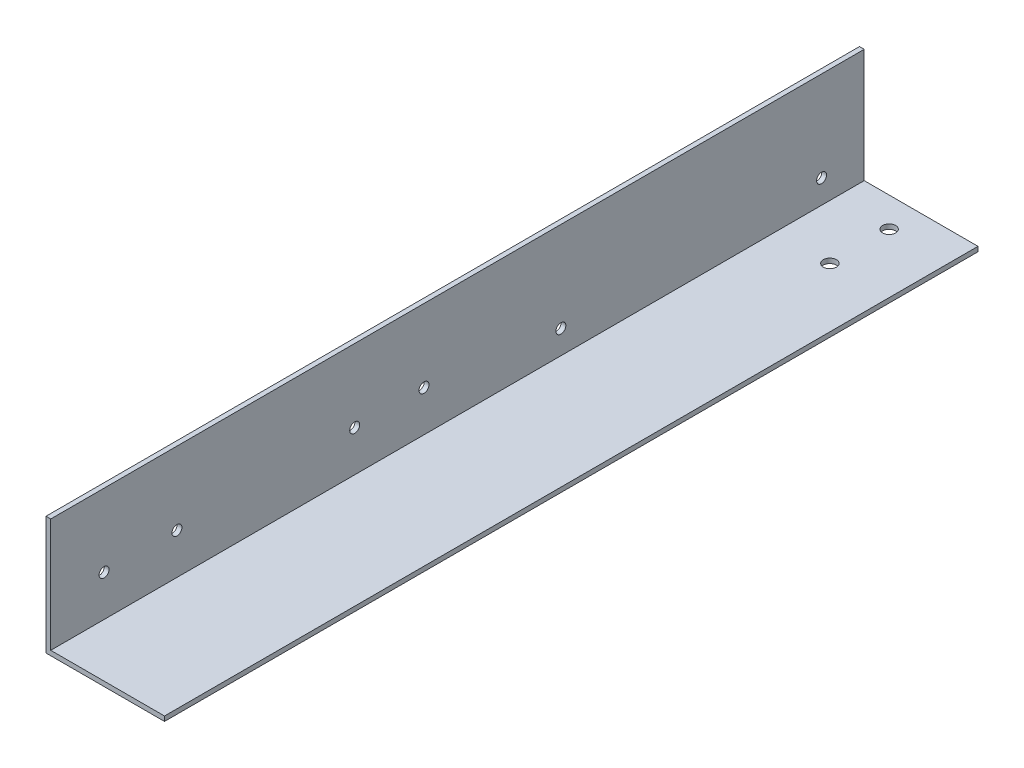
ISO-10303-21;
HEADER;
FILE_DESCRIPTION(('STEP AP214'),'2;1');
FILE_NAME('part.step','',(''),(''),'','','');
FILE_SCHEMA(('AUTOMOTIVE_DESIGN { 1 0 10303 214 1 1 1 1 }'));
ENDSEC;
DATA;
#1=APPLICATION_CONTEXT('core data for automotive mechanical design processes');
#2=APPLICATION_PROTOCOL_DEFINITION('international standard','automotive_design',2000,#1);
#3=PRODUCT_CONTEXT('',#1,'mechanical');
#4=PRODUCT('Part','Part','',(#3));
#5=PRODUCT_RELATED_PRODUCT_CATEGORY('part','',(#4));
#6=PRODUCT_DEFINITION_FORMATION('','',#4);
#7=PRODUCT_DEFINITION_CONTEXT('part definition',#1,'design');
#8=PRODUCT_DEFINITION('design','',#6,#7);
#9=PRODUCT_DEFINITION_SHAPE('','',#8);
#10=(LENGTH_UNIT() NAMED_UNIT(*) SI_UNIT(.MILLI.,.METRE.));
#11=(NAMED_UNIT(*) PLANE_ANGLE_UNIT() SI_UNIT($,.RADIAN.));
#12=(NAMED_UNIT(*) SI_UNIT($,.STERADIAN.) SOLID_ANGLE_UNIT());
#13=UNCERTAINTY_MEASURE_WITH_UNIT(LENGTH_MEASURE(1.E-05),#10,'distance_accuracy_value','');
#14=(GEOMETRIC_REPRESENTATION_CONTEXT(3) GLOBAL_UNCERTAINTY_ASSIGNED_CONTEXT((#13)) GLOBAL_UNIT_ASSIGNED_CONTEXT((#10,
#11,#12)) REPRESENTATION_CONTEXT('',''));
#15=CARTESIAN_POINT('',(0.,0.,0.));
#16=DIRECTION('',(0.,0.,1.));
#17=DIRECTION('',(1.,0.,0.));
#18=AXIS2_PLACEMENT_3D('',#15,#16,#17);
#19=CARTESIAN_POINT('',(0.,50.,343.25));
#20=DIRECTION('',(1.,0.,0.));
#21=DIRECTION('',(0.,0.,-1.));
#22=AXIS2_PLACEMENT_3D('',#19,#20,#21);
#23=PLANE('',#22);
#24=CARTESIAN_POINT('',(0.,12.,18.));
#25=DIRECTION('',(1.,0.,0.));
#26=DIRECTION('',(0.,0.,-1.));
#27=AXIS2_PLACEMENT_3D('',#24,#25,#26);
#28=CIRCLE('',#27,2.1);
#29=CARTESIAN_POINT('',(0.,12.,15.9));
#30=VERTEX_POINT('',#29);
#31=EDGE_CURVE('E144',#30,#30,#28,.T.);
#32=ORIENTED_EDGE('',*,*,#31,.T.);
#33=EDGE_LOOP('',(#32));
#34=FACE_BOUND('',#33,.T.);
#35=CARTESIAN_POINT('',(0.,12.,128.));
#36=DIRECTION('',(1.,0.,0.));
#37=DIRECTION('',(0.,0.,-1.));
#38=AXIS2_PLACEMENT_3D('',#35,#36,#37);
#39=CIRCLE('',#38,2.09999999999999);
#40=CARTESIAN_POINT('',(0.,12.,125.9));
#41=VERTEX_POINT('',#40);
#42=EDGE_CURVE('E159',#41,#41,#39,.T.);
#43=ORIENTED_EDGE('',*,*,#42,.T.);
#44=EDGE_LOOP('',(#43));
#45=FACE_BOUND('',#44,.T.);
#46=CARTESIAN_POINT('',(0.,19.25,185.75));
#47=DIRECTION('',(1.,0.,0.));
#48=DIRECTION('',(0.,0.,-1.));
#49=AXIS2_PLACEMENT_3D('',#46,#47,#48);
#50=CIRCLE('',#49,2.09999999999999);
#51=CARTESIAN_POINT('',(0.,19.25,183.65));
#52=VERTEX_POINT('',#51);
#53=EDGE_CURVE('E127',#52,#52,#50,.T.);
#54=ORIENTED_EDGE('',*,*,#53,.T.);
#55=EDGE_LOOP('',(#54));
#56=FACE_BOUND('',#55,.T.);
#57=CARTESIAN_POINT('',(0.,19.25,215.));
#58=DIRECTION('',(1.,0.,0.));
#59=DIRECTION('',(0.,0.,-1.));
#60=AXIS2_PLACEMENT_3D('',#57,#58,#59);
#61=CIRCLE('',#60,2.09999999999999);
#62=CARTESIAN_POINT('',(0.,19.25,212.9));
#63=VERTEX_POINT('',#62);
#64=EDGE_CURVE('E152',#63,#63,#61,.T.);
#65=ORIENTED_EDGE('',*,*,#64,.T.);
#66=EDGE_LOOP('',(#65));
#67=FACE_BOUND('',#66,.T.);
#68=CARTESIAN_POINT('',(0.,19.25,290.));
#69=DIRECTION('',(1.,0.,0.));
#70=DIRECTION('',(0.,0.,-1.));
#71=AXIS2_PLACEMENT_3D('',#68,#69,#70);
#72=CIRCLE('',#71,2.09999999999999);
#73=CARTESIAN_POINT('',(0.,19.25,287.9));
#74=VERTEX_POINT('',#73);
#75=EDGE_CURVE('E148',#74,#74,#72,.T.);
#76=ORIENTED_EDGE('',*,*,#75,.T.);
#77=EDGE_LOOP('',(#76));
#78=FACE_BOUND('',#77,.T.);
#79=CARTESIAN_POINT('',(0.,19.25,320.75));
#80=DIRECTION('',(1.,0.,0.));
#81=DIRECTION('',(0.,0.,-1.));
#82=AXIS2_PLACEMENT_3D('',#79,#80,#81);
#83=CIRCLE('',#82,2.09999999999999);
#84=CARTESIAN_POINT('',(0.,19.25,318.65));
#85=VERTEX_POINT('',#84);
#86=EDGE_CURVE('E143',#85,#85,#83,.T.);
#87=ORIENTED_EDGE('',*,*,#86,.T.);
#88=EDGE_LOOP('',(#87));
#89=FACE_BOUND('',#88,.T.);
#90=DIRECTION('',(0.,-1.,0.));
#91=VECTOR('',#90,1.);
#92=CARTESIAN_POINT('',(0.,50.,0.));
#93=LINE('',#92,#91);
#94=CARTESIAN_POINT('',(0.,50.,0.));
#95=VERTEX_POINT('',#94);
#96=CARTESIAN_POINT('',(0.,0.,0.));
#97=VERTEX_POINT('',#96);
#98=EDGE_CURVE('E123',#95,#97,#93,.T.);
#99=ORIENTED_EDGE('',*,*,#98,.T.);
#100=DIRECTION('',(0.,0.,-1.));
#101=VECTOR('',#100,1.);
#102=CARTESIAN_POINT('',(0.,0.,343.25));
#103=LINE('',#102,#101);
#104=CARTESIAN_POINT('',(0.,0.,343.25));
#105=VERTEX_POINT('',#104);
#106=EDGE_CURVE('E11',#105,#97,#103,.T.);
#107=ORIENTED_EDGE('',*,*,#106,.F.);
#108=DIRECTION('',(0.,-1.,0.));
#109=VECTOR('',#108,1.);
#110=CARTESIAN_POINT('',(0.,50.,343.25));
#111=LINE('',#110,#109);
#112=CARTESIAN_POINT('',(0.,50.,343.25));
#113=VERTEX_POINT('',#112);
#114=EDGE_CURVE('E134',#113,#105,#111,.T.);
#115=ORIENTED_EDGE('',*,*,#114,.F.);
#116=DIRECTION('',(0.,0.,-1.));
#117=VECTOR('',#116,1.);
#118=CARTESIAN_POINT('',(0.,50.,343.25));
#119=LINE('',#118,#117);
#120=EDGE_CURVE('E119',#113,#95,#119,.T.);
#121=ORIENTED_EDGE('',*,*,#120,.T.);
#122=EDGE_LOOP('',(#99,#107,#115,#121));
#123=FACE_BOUND('',#122,.T.);
#124=ADVANCED_FACE('F37',(#34,#45,#56,#67,#78,#89,#123),#23,.F.);
#125=CARTESIAN_POINT('',(0.,0.,343.25));
#126=DIRECTION('',(0.,1.,0.));
#127=DIRECTION('',(0.,0.,1.));
#128=AXIS2_PLACEMENT_3D('',#125,#126,#127);
#129=PLANE('',#128);
#130=CARTESIAN_POINT('',(25.,0.,12.5));
#131=DIRECTION('',(0.,1.,0.));
#132=DIRECTION('',(0.,0.,1.));
#133=AXIS2_PLACEMENT_3D('',#130,#131,#132);
#134=CIRCLE('',#133,2.75);
#135=CARTESIAN_POINT('',(25.,0.,15.25));
#136=VERTEX_POINT('',#135);
#137=EDGE_CURVE('E160',#136,#136,#134,.T.);
#138=ORIENTED_EDGE('',*,*,#137,.T.);
#139=EDGE_LOOP('',(#138));
#140=FACE_BOUND('',#139,.T.);
#141=CARTESIAN_POINT('',(25.,0.,37.5));
#142=DIRECTION('',(0.,1.,0.));
#143=DIRECTION('',(0.,0.,1.));
#144=AXIS2_PLACEMENT_3D('',#141,#142,#143);
#145=CIRCLE('',#144,2.75);
#146=CARTESIAN_POINT('',(25.,0.,40.25));
#147=VERTEX_POINT('',#146);
#148=EDGE_CURVE('E165',#147,#147,#145,.T.);
#149=ORIENTED_EDGE('',*,*,#148,.T.);
#150=EDGE_LOOP('',(#149));
#151=FACE_BOUND('',#150,.T.);
#152=DIRECTION('',(1.,0.,0.));
#153=VECTOR('',#152,1.);
#154=CARTESIAN_POINT('',(0.,0.,0.));
#155=LINE('',#154,#153);
#156=CARTESIAN_POINT('',(50.,0.,0.));
#157=VERTEX_POINT('',#156);
#158=EDGE_CURVE('E126',#97,#157,#155,.T.);
#159=ORIENTED_EDGE('',*,*,#158,.T.);
#160=DIRECTION('',(0.,0.,-1.));
#161=VECTOR('',#160,1.);
#162=CARTESIAN_POINT('',(50.,0.,343.25));
#163=LINE('',#162,#161);
#164=CARTESIAN_POINT('',(50.,0.,343.25));
#165=VERTEX_POINT('',#164);
#166=EDGE_CURVE('E46',#165,#157,#163,.T.);
#167=ORIENTED_EDGE('',*,*,#166,.F.);
#168=DIRECTION('',(1.,0.,0.));
#169=VECTOR('',#168,1.);
#170=CARTESIAN_POINT('',(0.,0.,343.25));
#171=LINE('',#170,#169);
#172=EDGE_CURVE('E92',#105,#165,#171,.T.);
#173=ORIENTED_EDGE('',*,*,#172,.F.);
#174=ORIENTED_EDGE('',*,*,#106,.T.);
#175=EDGE_LOOP('',(#159,#167,#173,#174));
#176=FACE_BOUND('',#175,.T.);
#177=ADVANCED_FACE('F191',(#140,#151,#176),#129,.F.);
#178=CARTESIAN_POINT('',(50.,0.,343.25));
#179=DIRECTION('',(-1.,0.,0.));
#180=DIRECTION('',(0.,0.,1.));
#181=AXIS2_PLACEMENT_3D('',#178,#179,#180);
#182=PLANE('',#181);
#183=DIRECTION('',(0.,1.,0.));
#184=VECTOR('',#183,1.);
#185=CARTESIAN_POINT('',(50.,0.,0.));
#186=LINE('',#185,#184);
#187=CARTESIAN_POINT('',(50.,2.,0.));
#188=VERTEX_POINT('',#187);
#189=EDGE_CURVE('E129',#157,#188,#186,.T.);
#190=ORIENTED_EDGE('',*,*,#189,.T.);
#191=DIRECTION('',(0.,0.,-1.));
#192=VECTOR('',#191,1.);
#193=CARTESIAN_POINT('',(50.,2.,343.25));
#194=LINE('',#193,#192);
#195=CARTESIAN_POINT('',(50.,2.,343.25));
#196=VERTEX_POINT('',#195);
#197=EDGE_CURVE('E114',#196,#188,#194,.T.);
#198=ORIENTED_EDGE('',*,*,#197,.F.);
#199=DIRECTION('',(0.,1.,0.));
#200=VECTOR('',#199,1.);
#201=CARTESIAN_POINT('',(50.,0.,343.25));
#202=LINE('',#201,#200);
#203=EDGE_CURVE('E105',#165,#196,#202,.T.);
#204=ORIENTED_EDGE('',*,*,#203,.F.);
#205=ORIENTED_EDGE('',*,*,#166,.T.);
#206=EDGE_LOOP('',(#190,#198,#204,#205));
#207=FACE_BOUND('',#206,.T.);
#208=ADVANCED_FACE('F194',(#207),#182,.F.);
#209=CARTESIAN_POINT('',(50.,2.,343.25));
#210=DIRECTION('',(0.,-1.,0.));
#211=DIRECTION('',(0.,0.,-1.));
#212=AXIS2_PLACEMENT_3D('',#209,#210,#211);
#213=PLANE('',#212);
#214=CARTESIAN_POINT('',(25.,2.,12.5));
#215=DIRECTION('',(0.,-1.,0.));
#216=DIRECTION('',(0.,0.,-1.));
#217=AXIS2_PLACEMENT_3D('',#214,#215,#216);
#218=CIRCLE('',#217,2.75);
#219=CARTESIAN_POINT('',(25.,2.,9.75));
#220=VERTEX_POINT('',#219);
#221=EDGE_CURVE('E40',#220,#220,#218,.T.);
#222=ORIENTED_EDGE('',*,*,#221,.T.);
#223=EDGE_LOOP('',(#222));
#224=FACE_BOUND('',#223,.T.);
#225=CARTESIAN_POINT('',(25.,2.,37.5));
#226=DIRECTION('',(0.,-1.,0.));
#227=DIRECTION('',(0.,0.,-1.));
#228=AXIS2_PLACEMENT_3D('',#225,#226,#227);
#229=CIRCLE('',#228,2.75);
#230=CARTESIAN_POINT('',(25.,2.,34.75));
#231=VERTEX_POINT('',#230);
#232=EDGE_CURVE('E163',#231,#231,#229,.T.);
#233=ORIENTED_EDGE('',*,*,#232,.T.);
#234=EDGE_LOOP('',(#233));
#235=FACE_BOUND('',#234,.T.);
#236=DIRECTION('',(-1.,0.,0.));
#237=VECTOR('',#236,1.);
#238=CARTESIAN_POINT('',(50.,2.,0.));
#239=LINE('',#238,#237);
#240=CARTESIAN_POINT('',(2.,2.,0.));
#241=VERTEX_POINT('',#240);
#242=EDGE_CURVE('E113',#188,#241,#239,.T.);
#243=ORIENTED_EDGE('',*,*,#242,.T.);
#244=DIRECTION('',(0.,0.,-1.));
#245=VECTOR('',#244,1.);
#246=CARTESIAN_POINT('',(2.,2.,343.25));
#247=LINE('',#246,#245);
#248=CARTESIAN_POINT('',(2.,2.,343.25));
#249=VERTEX_POINT('',#248);
#250=EDGE_CURVE('E110',#249,#241,#247,.T.);
#251=ORIENTED_EDGE('',*,*,#250,.F.);
#252=DIRECTION('',(-1.,0.,0.));
#253=VECTOR('',#252,1.);
#254=CARTESIAN_POINT('',(50.,2.,343.25));
#255=LINE('',#254,#253);
#256=EDGE_CURVE('E99',#196,#249,#255,.T.);
#257=ORIENTED_EDGE('',*,*,#256,.F.);
#258=ORIENTED_EDGE('',*,*,#197,.T.);
#259=EDGE_LOOP('',(#243,#251,#257,#258));
#260=FACE_BOUND('',#259,.T.);
#261=ADVANCED_FACE('F111',(#224,#235,#260),#213,.F.);
#262=CARTESIAN_POINT('',(2.,2.,343.25));
#263=DIRECTION('',(-1.,0.,0.));
#264=DIRECTION('',(0.,0.,1.));
#265=AXIS2_PLACEMENT_3D('',#262,#263,#264);
#266=PLANE('',#265);
#267=CARTESIAN_POINT('',(2.,12.,18.));
#268=DIRECTION('',(-1.,0.,0.));
#269=DIRECTION('',(0.,0.,1.));
#270=AXIS2_PLACEMENT_3D('',#267,#268,#269);
#271=CIRCLE('',#270,2.1);
#272=CARTESIAN_POINT('',(2.,12.,20.1));
#273=VERTEX_POINT('',#272);
#274=EDGE_CURVE('E161',#273,#273,#271,.T.);
#275=ORIENTED_EDGE('',*,*,#274,.T.);
#276=EDGE_LOOP('',(#275));
#277=FACE_BOUND('',#276,.T.);
#278=CARTESIAN_POINT('',(2.,12.,128.));
#279=DIRECTION('',(-1.,0.,0.));
#280=DIRECTION('',(0.,0.,1.));
#281=AXIS2_PLACEMENT_3D('',#278,#279,#280);
#282=CIRCLE('',#281,2.09999999999999);
#283=CARTESIAN_POINT('',(2.,12.,130.1));
#284=VERTEX_POINT('',#283);
#285=EDGE_CURVE('E156',#284,#284,#282,.T.);
#286=ORIENTED_EDGE('',*,*,#285,.T.);
#287=EDGE_LOOP('',(#286));
#288=FACE_BOUND('',#287,.T.);
#289=CARTESIAN_POINT('',(2.,19.25,185.75));
#290=DIRECTION('',(-1.,0.,0.));
#291=DIRECTION('',(0.,0.,1.));
#292=AXIS2_PLACEMENT_3D('',#289,#290,#291);
#293=CIRCLE('',#292,2.09999999999999);
#294=CARTESIAN_POINT('',(2.,19.25,187.85));
#295=VERTEX_POINT('',#294);
#296=EDGE_CURVE('E153',#295,#295,#293,.T.);
#297=ORIENTED_EDGE('',*,*,#296,.T.);
#298=EDGE_LOOP('',(#297));
#299=FACE_BOUND('',#298,.T.);
#300=CARTESIAN_POINT('',(2.,19.25,215.));
#301=DIRECTION('',(-1.,0.,0.));
#302=DIRECTION('',(0.,0.,1.));
#303=AXIS2_PLACEMENT_3D('',#300,#301,#302);
#304=CIRCLE('',#303,2.09999999999999);
#305=CARTESIAN_POINT('',(2.,19.25,217.1));
#306=VERTEX_POINT('',#305);
#307=EDGE_CURVE('E149',#306,#306,#304,.T.);
#308=ORIENTED_EDGE('',*,*,#307,.T.);
#309=EDGE_LOOP('',(#308));
#310=FACE_BOUND('',#309,.T.);
#311=CARTESIAN_POINT('',(2.,19.25,290.));
#312=DIRECTION('',(-1.,0.,0.));
#313=DIRECTION('',(0.,0.,1.));
#314=AXIS2_PLACEMENT_3D('',#311,#312,#313);
#315=CIRCLE('',#314,2.09999999999999);
#316=CARTESIAN_POINT('',(2.,19.25,292.1));
#317=VERTEX_POINT('',#316);
#318=EDGE_CURVE('E145',#317,#317,#315,.T.);
#319=ORIENTED_EDGE('',*,*,#318,.T.);
#320=EDGE_LOOP('',(#319));
#321=FACE_BOUND('',#320,.T.);
#322=CARTESIAN_POINT('',(2.,19.25,320.75));
#323=DIRECTION('',(-1.,0.,0.));
#324=DIRECTION('',(0.,0.,1.));
#325=AXIS2_PLACEMENT_3D('',#322,#323,#324);
#326=CIRCLE('',#325,2.09999999999999);
#327=CARTESIAN_POINT('',(2.,19.25,322.85));
#328=VERTEX_POINT('',#327);
#329=EDGE_CURVE('E140',#328,#328,#326,.T.);
#330=ORIENTED_EDGE('',*,*,#329,.T.);
#331=EDGE_LOOP('',(#330));
#332=FACE_BOUND('',#331,.T.);
#333=DIRECTION('',(0.,1.,0.));
#334=VECTOR('',#333,1.);
#335=CARTESIAN_POINT('',(2.,2.,0.));
#336=LINE('',#335,#334);
#337=CARTESIAN_POINT('',(2.,50.,0.));
#338=VERTEX_POINT('',#337);
#339=EDGE_CURVE('E78',#241,#338,#336,.T.);
#340=ORIENTED_EDGE('',*,*,#339,.T.);
#341=DIRECTION('',(0.,0.,-1.));
#342=VECTOR('',#341,1.);
#343=CARTESIAN_POINT('',(2.,50.,343.25));
#344=LINE('',#343,#342);
#345=CARTESIAN_POINT('',(2.,50.,343.25));
#346=VERTEX_POINT('',#345);
#347=EDGE_CURVE('E115',#346,#338,#344,.T.);
#348=ORIENTED_EDGE('',*,*,#347,.F.);
#349=DIRECTION('',(0.,1.,0.));
#350=VECTOR('',#349,1.);
#351=CARTESIAN_POINT('',(2.,2.,343.25));
#352=LINE('',#351,#350);
#353=EDGE_CURVE('E103',#249,#346,#352,.T.);
#354=ORIENTED_EDGE('',*,*,#353,.F.);
#355=ORIENTED_EDGE('',*,*,#250,.T.);
#356=EDGE_LOOP('',(#340,#348,#354,#355));
#357=FACE_BOUND('',#356,.T.);
#358=ADVANCED_FACE('F117',(#277,#288,#299,#310,#321,#332,#357),#266,.F.);
#359=CARTESIAN_POINT('',(2.,50.,343.25));
#360=DIRECTION('',(0.,-1.,0.));
#361=DIRECTION('',(0.,0.,-1.));
#362=AXIS2_PLACEMENT_3D('',#359,#360,#361);
#363=PLANE('',#362);
#364=DIRECTION('',(-1.,0.,0.));
#365=VECTOR('',#364,1.);
#366=CARTESIAN_POINT('',(2.,50.,0.));
#367=LINE('',#366,#365);
#368=EDGE_CURVE('E84',#338,#95,#367,.T.);
#369=ORIENTED_EDGE('',*,*,#368,.T.);
#370=ORIENTED_EDGE('',*,*,#120,.F.);
#371=DIRECTION('',(-1.,0.,0.));
#372=VECTOR('',#371,1.);
#373=CARTESIAN_POINT('',(2.,50.,343.25));
#374=LINE('',#373,#372);
#375=EDGE_CURVE('E55',#346,#113,#374,.T.);
#376=ORIENTED_EDGE('',*,*,#375,.F.);
#377=ORIENTED_EDGE('',*,*,#347,.T.);
#378=EDGE_LOOP('',(#369,#370,#376,#377));
#379=FACE_BOUND('',#378,.T.);
#380=ADVANCED_FACE('F199',(#379),#363,.F.);
#381=CARTESIAN_POINT('',(0.,0.,343.25));
#382=DIRECTION('',(0.,0.,1.));
#383=DIRECTION('',(1.,0.,0.));
#384=AXIS2_PLACEMENT_3D('',#381,#382,#383);
#385=PLANE('',#384);
#386=ORIENTED_EDGE('',*,*,#114,.T.);
#387=ORIENTED_EDGE('',*,*,#172,.T.);
#388=ORIENTED_EDGE('',*,*,#203,.T.);
#389=ORIENTED_EDGE('',*,*,#256,.T.);
#390=ORIENTED_EDGE('',*,*,#353,.T.);
#391=ORIENTED_EDGE('',*,*,#375,.T.);
#392=EDGE_LOOP('',(#386,#387,#388,#389,#390,#391));
#393=FACE_BOUND('',#392,.T.);
#394=ADVANCED_FACE('F101',(#393),#385,.T.);
#395=CARTESIAN_POINT('',(0.,0.,0.));
#396=DIRECTION('',(0.,0.,1.));
#397=DIRECTION('',(1.,0.,0.));
#398=AXIS2_PLACEMENT_3D('',#395,#396,#397);
#399=PLANE('',#398);
#400=ORIENTED_EDGE('',*,*,#98,.F.);
#401=ORIENTED_EDGE('',*,*,#368,.F.);
#402=ORIENTED_EDGE('',*,*,#339,.F.);
#403=ORIENTED_EDGE('',*,*,#242,.F.);
#404=ORIENTED_EDGE('',*,*,#189,.F.);
#405=ORIENTED_EDGE('',*,*,#158,.F.);
#406=EDGE_LOOP('',(#400,#401,#402,#403,#404,#405));
#407=FACE_BOUND('',#406,.T.);
#408=ADVANCED_FACE('F197',(#407),#399,.F.);
#409=CARTESIAN_POINT('',(-5.,19.25,320.75));
#410=DIRECTION('',(1.,0.,0.));
#411=DIRECTION('',(0.,0.,-1.));
#412=AXIS2_PLACEMENT_3D('',#409,#410,#411);
#413=CYLINDRICAL_SURFACE('',#412,2.09999999999999);
#414=ORIENTED_EDGE('',*,*,#329,.F.);
#415=EDGE_LOOP('',(#414));
#416=FACE_BOUND('',#415,.T.);
#417=ORIENTED_EDGE('',*,*,#86,.F.);
#418=EDGE_LOOP('',(#417));
#419=FACE_BOUND('',#418,.T.);
#420=ADVANCED_FACE('F228',(#416,#419),#413,.F.);
#421=CARTESIAN_POINT('',(-5.,19.25,290.));
#422=DIRECTION('',(1.,0.,0.));
#423=DIRECTION('',(0.,0.,-1.));
#424=AXIS2_PLACEMENT_3D('',#421,#422,#423);
#425=CYLINDRICAL_SURFACE('',#424,2.09999999999999);
#426=ORIENTED_EDGE('',*,*,#318,.F.);
#427=EDGE_LOOP('',(#426));
#428=FACE_BOUND('',#427,.T.);
#429=ORIENTED_EDGE('',*,*,#75,.F.);
#430=EDGE_LOOP('',(#429));
#431=FACE_BOUND('',#430,.T.);
#432=ADVANCED_FACE('F230',(#428,#431),#425,.F.);
#433=CARTESIAN_POINT('',(-5.,19.25,215.));
#434=DIRECTION('',(1.,0.,0.));
#435=DIRECTION('',(0.,0.,-1.));
#436=AXIS2_PLACEMENT_3D('',#433,#434,#435);
#437=CYLINDRICAL_SURFACE('',#436,2.09999999999999);
#438=ORIENTED_EDGE('',*,*,#307,.F.);
#439=EDGE_LOOP('',(#438));
#440=FACE_BOUND('',#439,.T.);
#441=ORIENTED_EDGE('',*,*,#64,.F.);
#442=EDGE_LOOP('',(#441));
#443=FACE_BOUND('',#442,.T.);
#444=ADVANCED_FACE('F237',(#440,#443),#437,.F.);
#445=CARTESIAN_POINT('',(-5.,19.25,185.75));
#446=DIRECTION('',(1.,0.,0.));
#447=DIRECTION('',(0.,0.,-1.));
#448=AXIS2_PLACEMENT_3D('',#445,#446,#447);
#449=CYLINDRICAL_SURFACE('',#448,2.09999999999999);
#450=ORIENTED_EDGE('',*,*,#296,.F.);
#451=EDGE_LOOP('',(#450));
#452=FACE_BOUND('',#451,.T.);
#453=ORIENTED_EDGE('',*,*,#53,.F.);
#454=EDGE_LOOP('',(#453));
#455=FACE_BOUND('',#454,.T.);
#456=ADVANCED_FACE('F244',(#452,#455),#449,.F.);
#457=CARTESIAN_POINT('',(-5.,12.,128.));
#458=DIRECTION('',(1.,0.,0.));
#459=DIRECTION('',(0.,0.,-1.));
#460=AXIS2_PLACEMENT_3D('',#457,#458,#459);
#461=CYLINDRICAL_SURFACE('',#460,2.09999999999999);
#462=ORIENTED_EDGE('',*,*,#285,.F.);
#463=EDGE_LOOP('',(#462));
#464=FACE_BOUND('',#463,.T.);
#465=ORIENTED_EDGE('',*,*,#42,.F.);
#466=EDGE_LOOP('',(#465));
#467=FACE_BOUND('',#466,.T.);
#468=ADVANCED_FACE('F248',(#464,#467),#461,.F.);
#469=CARTESIAN_POINT('',(-5.,12.,18.));
#470=DIRECTION('',(1.,0.,0.));
#471=DIRECTION('',(0.,0.,-1.));
#472=AXIS2_PLACEMENT_3D('',#469,#470,#471);
#473=CYLINDRICAL_SURFACE('',#472,2.1);
#474=ORIENTED_EDGE('',*,*,#274,.F.);
#475=EDGE_LOOP('',(#474));
#476=FACE_BOUND('',#475,.T.);
#477=ORIENTED_EDGE('',*,*,#31,.F.);
#478=EDGE_LOOP('',(#477));
#479=FACE_BOUND('',#478,.T.);
#480=ADVANCED_FACE('F252',(#476,#479),#473,.F.);
#481=CARTESIAN_POINT('',(25.,-5.,37.5));
#482=DIRECTION('',(0.,1.,0.));
#483=DIRECTION('',(0.,0.,1.));
#484=AXIS2_PLACEMENT_3D('',#481,#482,#483);
#485=CYLINDRICAL_SURFACE('',#484,2.75);
#486=ORIENTED_EDGE('',*,*,#232,.F.);
#487=EDGE_LOOP('',(#486));
#488=FACE_BOUND('',#487,.T.);
#489=ORIENTED_EDGE('',*,*,#148,.F.);
#490=EDGE_LOOP('',(#489));
#491=FACE_BOUND('',#490,.T.);
#492=ADVANCED_FACE('F256',(#488,#491),#485,.F.);
#493=CARTESIAN_POINT('',(25.,-5.,12.5));
#494=DIRECTION('',(0.,1.,0.));
#495=DIRECTION('',(0.,0.,1.));
#496=AXIS2_PLACEMENT_3D('',#493,#494,#495);
#497=CYLINDRICAL_SURFACE('',#496,2.75);
#498=ORIENTED_EDGE('',*,*,#221,.F.);
#499=EDGE_LOOP('',(#498));
#500=FACE_BOUND('',#499,.T.);
#501=ORIENTED_EDGE('',*,*,#137,.F.);
#502=EDGE_LOOP('',(#501));
#503=FACE_BOUND('',#502,.T.);
#504=ADVANCED_FACE('F260',(#500,#503),#497,.F.);
#505=CLOSED_SHELL('',(#124,#177,#208,#261,#358,#380,#394,#408,#420,#432,#444,#456,#468,#480,
#492,#504));
#506=MANIFOLD_SOLID_BREP('B2',#505);
#507=ADVANCED_BREP_SHAPE_REPRESENTATION('',(#18,#506),#14);
#508=SHAPE_DEFINITION_REPRESENTATION(#9,#507);
ENDSEC;
END-ISO-10303-21;
